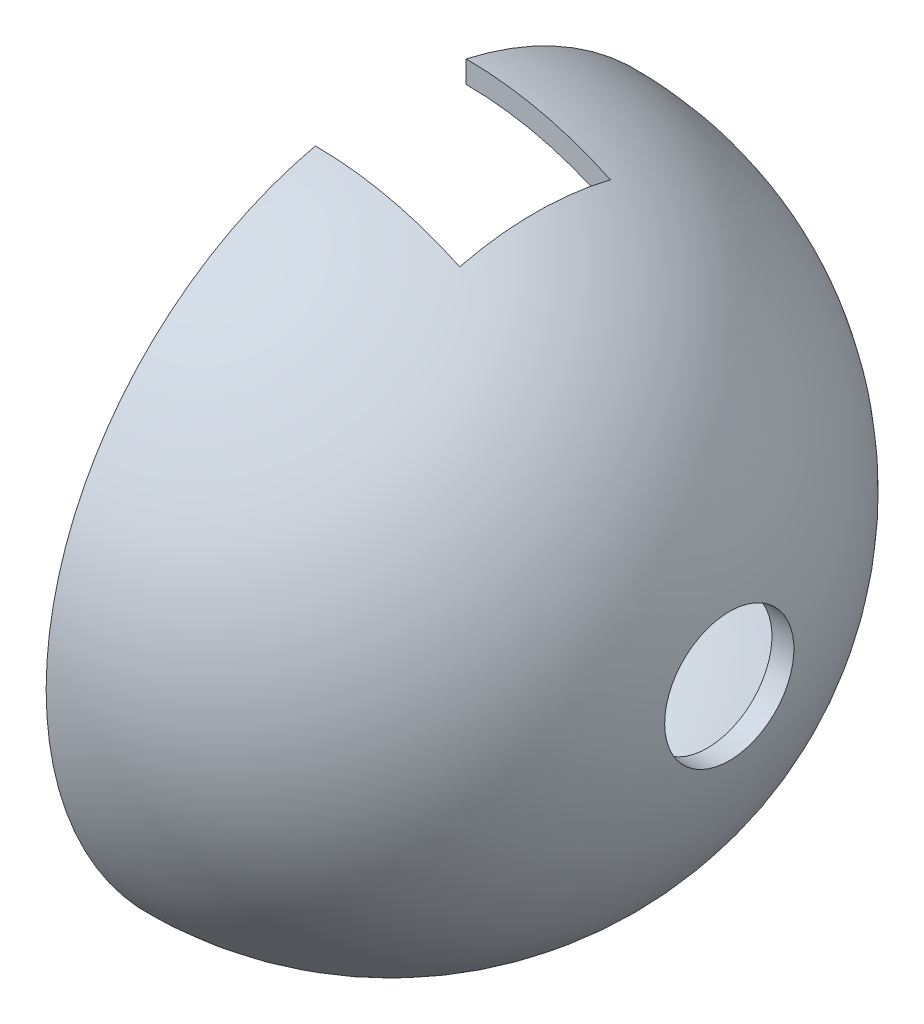
ISO-10303-21;
HEADER;
FILE_DESCRIPTION(('STEP AP214'),'2;1');
FILE_NAME('part.step','',(''),(''),'','','');
FILE_SCHEMA(('AUTOMOTIVE_DESIGN { 1 0 10303 214 1 1 1 1 }'));
ENDSEC;
DATA;
#1=APPLICATION_CONTEXT('core data for automotive mechanical design processes');
#2=APPLICATION_PROTOCOL_DEFINITION('international standard','automotive_design',2000,#1);
#3=PRODUCT_CONTEXT('',#1,'mechanical');
#4=PRODUCT('Part','Part','',(#3));
#5=PRODUCT_RELATED_PRODUCT_CATEGORY('part','',(#4));
#6=PRODUCT_DEFINITION_FORMATION('','',#4);
#7=PRODUCT_DEFINITION_CONTEXT('part definition',#1,'design');
#8=PRODUCT_DEFINITION('design','',#6,#7);
#9=PRODUCT_DEFINITION_SHAPE('','',#8);
#10=(LENGTH_UNIT() NAMED_UNIT(*) SI_UNIT(.MILLI.,.METRE.));
#11=(NAMED_UNIT(*) PLANE_ANGLE_UNIT() SI_UNIT($,.RADIAN.));
#12=(NAMED_UNIT(*) SI_UNIT($,.STERADIAN.) SOLID_ANGLE_UNIT());
#13=UNCERTAINTY_MEASURE_WITH_UNIT(LENGTH_MEASURE(1.E-05),#10,'distance_accuracy_value','');
#14=(GEOMETRIC_REPRESENTATION_CONTEXT(3) GLOBAL_UNCERTAINTY_ASSIGNED_CONTEXT((#13)) GLOBAL_UNIT_ASSIGNED_CONTEXT((#10,
#11,#12)) REPRESENTATION_CONTEXT('',''));
#15=CARTESIAN_POINT('',(0.,0.,0.));
#16=DIRECTION('',(0.,0.,1.));
#17=DIRECTION('',(1.,0.,0.));
#18=AXIS2_PLACEMENT_3D('',#15,#16,#17);
#19=CARTESIAN_POINT('',(0.,0.,0.));
#20=DIRECTION('',(0.,0.,1.));
#21=DIRECTION('',(0.,-1.,0.));
#22=AXIS2_PLACEMENT_3D('',#19,#20,#21);
#23=SPHERICAL_SURFACE('',#22,16.);
#24=CARTESIAN_POINT('',(15.7162336455017,0.,0.));
#25=DIRECTION('',(-1.,0.,0.));
#26=DIRECTION('',(0.,0.,1.));
#27=AXIS2_PLACEMENT_3D('',#24,#25,#26);
#28=CIRCLE('',#27,3.);
#29=CARTESIAN_POINT('',(15.7162336455017,0.,3.));
#30=VERTEX_POINT('',#29);
#31=EDGE_CURVE('E101',#30,#30,#28,.T.);
#32=ORIENTED_EDGE('',*,*,#31,.T.);
#33=EDGE_LOOP('',(#32));
#34=FACE_BOUND('',#33,.T.);
#35=CARTESIAN_POINT('',(0.,0.,0.));
#36=DIRECTION('',(-1.,0.,0.));
#37=DIRECTION('',(0.,0.,-1.));
#38=AXIS2_PLACEMENT_3D('',#35,#36,#37);
#39=CIRCLE('',#38,16.);
#40=CARTESIAN_POINT('',(0.,15.612494995996,-3.5));
#41=VERTEX_POINT('',#40);
#42=CARTESIAN_POINT('',(0.,15.612494995996,3.5));
#43=VERTEX_POINT('',#42);
#44=EDGE_CURVE('E94',#41,#43,#39,.T.);
#45=ORIENTED_EDGE('',*,*,#44,.F.);
#46=CARTESIAN_POINT('',(0.,0.,-3.5));
#47=DIRECTION('',(0.,0.,-1.));
#48=DIRECTION('',(-1.,0.,0.));
#49=AXIS2_PLACEMENT_3D('',#46,#47,#48);
#50=CIRCLE('',#49,15.612494995996);
#51=CARTESIAN_POINT('',(6.7,14.1017729381805,-3.5));
#52=VERTEX_POINT('',#51);
#53=EDGE_CURVE('E62',#41,#52,#50,.T.);
#54=ORIENTED_EDGE('',*,*,#53,.T.);
#55=CARTESIAN_POINT('',(6.7,0.,0.));
#56=DIRECTION('',(1.,0.,0.));
#57=DIRECTION('',(0.,0.,-1.));
#58=AXIS2_PLACEMENT_3D('',#55,#56,#57);
#59=CIRCLE('',#58,14.5296249091296);
#60=CARTESIAN_POINT('',(6.7,14.1017729381805,3.5));
#61=VERTEX_POINT('',#60);
#62=EDGE_CURVE('E95',#52,#61,#59,.T.);
#63=ORIENTED_EDGE('',*,*,#62,.T.);
#64=CARTESIAN_POINT('',(0.,0.,3.5));
#65=DIRECTION('',(0.,0.,1.));
#66=DIRECTION('',(1.,0.,0.));
#67=AXIS2_PLACEMENT_3D('',#64,#65,#66);
#68=CIRCLE('',#67,15.612494995996);
#69=EDGE_CURVE('E82',#61,#43,#68,.T.);
#70=ORIENTED_EDGE('',*,*,#69,.T.);
#71=EDGE_LOOP('',(#45,#54,#63,#70));
#72=FACE_BOUND('',#71,.T.);
#73=ADVANCED_FACE('F38',(#34,#72),#23,.T.);
#74=CARTESIAN_POINT('',(0.,0.,0.));
#75=DIRECTION('',(0.,0.,1.));
#76=DIRECTION('',(0.,-1.,0.));
#77=AXIS2_PLACEMENT_3D('',#74,#75,#76);
#78=SPHERICAL_SURFACE('',#77,15.);
#79=CARTESIAN_POINT('',(14.6969384566991,0.,0.));
#80=DIRECTION('',(-1.,0.,0.));
#81=DIRECTION('',(0.,0.,1.));
#82=AXIS2_PLACEMENT_3D('',#79,#80,#81);
#83=CIRCLE('',#82,3.);
#84=CARTESIAN_POINT('',(14.6969384566991,0.,3.));
#85=VERTEX_POINT('',#84);
#86=EDGE_CURVE('E107',#85,#85,#83,.F.);
#87=ORIENTED_EDGE('',*,*,#86,.T.);
#88=EDGE_LOOP('',(#87));
#89=FACE_BOUND('',#88,.T.);
#90=CARTESIAN_POINT('',(6.7,0.,0.));
#91=DIRECTION('',(1.,0.,0.));
#92=DIRECTION('',(0.,0.,-1.));
#93=AXIS2_PLACEMENT_3D('',#90,#91,#92);
#94=CIRCLE('',#93,13.4205066968427);
#95=CARTESIAN_POINT('',(6.7,12.9560796539694,3.5));
#96=VERTEX_POINT('',#95);
#97=CARTESIAN_POINT('',(6.7,12.9560796539694,-3.5));
#98=VERTEX_POINT('',#97);
#99=EDGE_CURVE('E11',#96,#98,#94,.F.);
#100=ORIENTED_EDGE('',*,*,#99,.T.);
#101=CARTESIAN_POINT('',(0.,0.,-3.5));
#102=DIRECTION('',(0.,0.,-1.));
#103=DIRECTION('',(-1.,0.,0.));
#104=AXIS2_PLACEMENT_3D('',#101,#102,#103);
#105=CIRCLE('',#104,14.5859521458148);
#106=CARTESIAN_POINT('',(0.,14.5859521458148,-3.5));
#107=VERTEX_POINT('',#106);
#108=EDGE_CURVE('E97',#98,#107,#105,.F.);
#109=ORIENTED_EDGE('',*,*,#108,.T.);
#110=CARTESIAN_POINT('',(0.,0.,0.));
#111=DIRECTION('',(1.,0.,0.));
#112=DIRECTION('',(0.,0.,-1.));
#113=AXIS2_PLACEMENT_3D('',#110,#111,#112);
#114=CIRCLE('',#113,15.);
#115=CARTESIAN_POINT('',(1.01853159452743E-13,14.5859521458148,3.5));
#116=VERTEX_POINT('',#115);
#117=EDGE_CURVE('E89',#116,#107,#114,.T.);
#118=ORIENTED_EDGE('',*,*,#117,.F.);
#119=CARTESIAN_POINT('',(0.,0.,3.5));
#120=DIRECTION('',(0.,0.,1.));
#121=DIRECTION('',(1.,0.,0.));
#122=AXIS2_PLACEMENT_3D('',#119,#120,#121);
#123=CIRCLE('',#122,14.5859521458148);
#124=EDGE_CURVE('E54',#116,#96,#123,.F.);
#125=ORIENTED_EDGE('',*,*,#124,.T.);
#126=EDGE_LOOP('',(#100,#109,#118,#125));
#127=FACE_BOUND('',#126,.T.);
#128=ADVANCED_FACE('F40',(#89,#127),#78,.F.);
#129=CARTESIAN_POINT('',(0.,0.,0.));
#130=DIRECTION('',(-1.,0.,0.));
#131=DIRECTION('',(0.,0.,-1.));
#132=AXIS2_PLACEMENT_3D('',#129,#130,#131);
#133=PLANE('',#132);
#134=DIRECTION('',(0.,-1.,0.));
#135=VECTOR('',#134,1.);
#136=CARTESIAN_POINT('',(0.,0.,-3.5));
#137=LINE('',#136,#135);
#138=EDGE_CURVE('E47',#41,#107,#137,.T.);
#139=ORIENTED_EDGE('',*,*,#138,.F.);
#140=ORIENTED_EDGE('',*,*,#44,.T.);
#141=DIRECTION('',(0.,1.,0.));
#142=VECTOR('',#141,1.);
#143=CARTESIAN_POINT('',(0.,0.,3.5));
#144=LINE('',#143,#142);
#145=EDGE_CURVE('E79',#116,#43,#144,.T.);
#146=ORIENTED_EDGE('',*,*,#145,.F.);
#147=ORIENTED_EDGE('',*,*,#117,.T.);
#148=EDGE_LOOP('',(#139,#140,#146,#147));
#149=FACE_BOUND('',#148,.T.);
#150=ADVANCED_FACE('F99',(#149),#133,.T.);
#151=CARTESIAN_POINT('',(10.2958949224479,0.,0.));
#152=DIRECTION('',(1.,0.,0.));
#153=DIRECTION('',(0.,0.,-1.));
#154=AXIS2_PLACEMENT_3D('',#151,#152,#153);
#155=CYLINDRICAL_SURFACE('',#154,3.);
#156=ORIENTED_EDGE('',*,*,#86,.F.);
#157=EDGE_LOOP('',(#156));
#158=FACE_BOUND('',#157,.T.);
#159=ORIENTED_EDGE('',*,*,#31,.F.);
#160=EDGE_LOOP('',(#159));
#161=FACE_BOUND('',#160,.T.);
#162=ADVANCED_FACE('F134',(#158,#161),#155,.F.);
#163=CARTESIAN_POINT('',(6.7,7.81447900915853,-3.5));
#164=DIRECTION('',(1.,0.,0.));
#165=DIRECTION('',(0.,0.,-1.));
#166=AXIS2_PLACEMENT_3D('',#163,#164,#165);
#167=PLANE('',#166);
#168=DIRECTION('',(0.,1.,0.));
#169=VECTOR('',#168,1.);
#170=CARTESIAN_POINT('',(6.7,7.81447900915853,-3.5));
#171=LINE('',#170,#169);
#172=EDGE_CURVE('E126',#98,#52,#171,.T.);
#173=ORIENTED_EDGE('',*,*,#172,.F.);
#174=ORIENTED_EDGE('',*,*,#99,.F.);
#175=DIRECTION('',(0.,1.,0.));
#176=VECTOR('',#175,1.);
#177=CARTESIAN_POINT('',(6.7,7.81447900915853,3.5));
#178=LINE('',#177,#176);
#179=EDGE_CURVE('E127',#96,#61,#178,.T.);
#180=ORIENTED_EDGE('',*,*,#179,.T.);
#181=ORIENTED_EDGE('',*,*,#62,.F.);
#182=EDGE_LOOP('',(#173,#174,#180,#181));
#183=FACE_BOUND('',#182,.T.);
#184=ADVANCED_FACE('F132',(#183),#167,.F.);
#185=CARTESIAN_POINT('',(0.,7.81447900915853,-3.5));
#186=DIRECTION('',(0.,0.,-1.));
#187=DIRECTION('',(-1.,0.,0.));
#188=AXIS2_PLACEMENT_3D('',#185,#186,#187);
#189=PLANE('',#188);
#190=ORIENTED_EDGE('',*,*,#138,.T.);
#191=ORIENTED_EDGE('',*,*,#108,.F.);
#192=ORIENTED_EDGE('',*,*,#172,.T.);
#193=ORIENTED_EDGE('',*,*,#53,.F.);
#194=EDGE_LOOP('',(#190,#191,#192,#193));
#195=FACE_BOUND('',#194,.T.);
#196=ADVANCED_FACE('F115',(#195),#189,.F.);
#197=CARTESIAN_POINT('',(0.,7.81447900915853,3.5));
#198=DIRECTION('',(0.,0.,1.));
#199=DIRECTION('',(1.,0.,0.));
#200=AXIS2_PLACEMENT_3D('',#197,#198,#199);
#201=PLANE('',#200);
#202=ORIENTED_EDGE('',*,*,#179,.F.);
#203=ORIENTED_EDGE('',*,*,#124,.F.);
#204=ORIENTED_EDGE('',*,*,#145,.T.);
#205=ORIENTED_EDGE('',*,*,#69,.F.);
#206=EDGE_LOOP('',(#202,#203,#204,#205));
#207=FACE_BOUND('',#206,.T.);
#208=ADVANCED_FACE('F81',(#207),#201,.F.);
#209=CLOSED_SHELL('',(#73,#128,#150,#162,#184,#196,#208));
#210=MANIFOLD_SOLID_BREP('B2',#209);
#211=ADVANCED_BREP_SHAPE_REPRESENTATION('',(#18,#210),#14);
#212=SHAPE_DEFINITION_REPRESENTATION(#9,#211);
ENDSEC;
END-ISO-10303-21;
